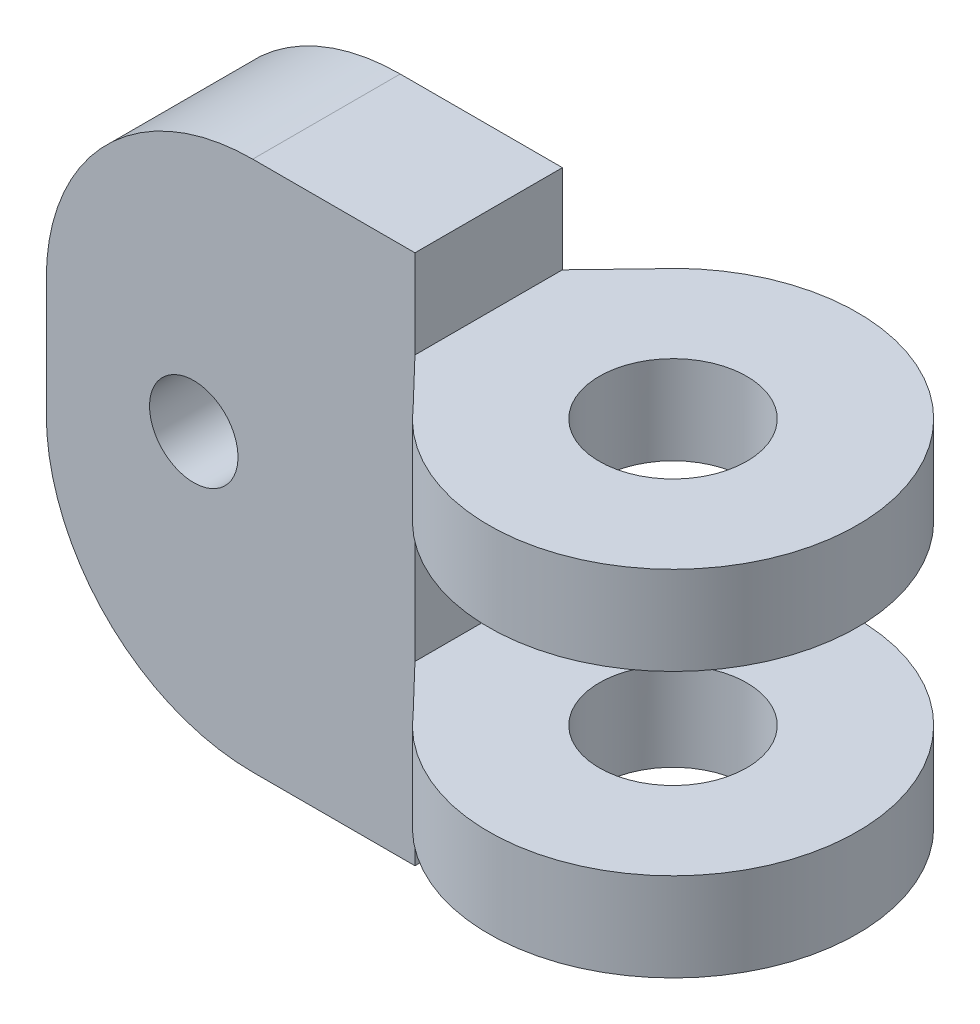
ISO-10303-21;
HEADER;
FILE_DESCRIPTION(('STEP AP214'),'2;1');
FILE_NAME('part.step','',(''),(''),'','','');
FILE_SCHEMA(('AUTOMOTIVE_DESIGN { 1 0 10303 214 1 1 1 1 }'));
ENDSEC;
DATA;
#1=APPLICATION_CONTEXT('core data for automotive mechanical design processes');
#2=APPLICATION_PROTOCOL_DEFINITION('international standard','automotive_design',2000,#1);
#3=PRODUCT_CONTEXT('',#1,'mechanical');
#4=PRODUCT('Part','Part','',(#3));
#5=PRODUCT_RELATED_PRODUCT_CATEGORY('part','',(#4));
#6=PRODUCT_DEFINITION_FORMATION('','',#4);
#7=PRODUCT_DEFINITION_CONTEXT('part definition',#1,'design');
#8=PRODUCT_DEFINITION('design','',#6,#7);
#9=PRODUCT_DEFINITION_SHAPE('','',#8);
#10=(LENGTH_UNIT() NAMED_UNIT(*) SI_UNIT(.MILLI.,.METRE.));
#11=(NAMED_UNIT(*) PLANE_ANGLE_UNIT() SI_UNIT($,.RADIAN.));
#12=(NAMED_UNIT(*) SI_UNIT($,.STERADIAN.) SOLID_ANGLE_UNIT());
#13=UNCERTAINTY_MEASURE_WITH_UNIT(LENGTH_MEASURE(1.E-05),#10,'distance_accuracy_value','');
#14=(GEOMETRIC_REPRESENTATION_CONTEXT(3) GLOBAL_UNCERTAINTY_ASSIGNED_CONTEXT((#13)) GLOBAL_UNIT_ASSIGNED_CONTEXT((#10,
#11,#12)) REPRESENTATION_CONTEXT('',''));
#15=CARTESIAN_POINT('',(0.,0.,0.));
#16=DIRECTION('',(0.,0.,1.));
#17=DIRECTION('',(1.,0.,0.));
#18=AXIS2_PLACEMENT_3D('',#15,#16,#17);
#19=CARTESIAN_POINT('',(23.75,2.1,15.));
#20=DIRECTION('',(0.,1.,0.));
#21=DIRECTION('',(-1.,0.,0.));
#22=AXIS2_PLACEMENT_3D('',#19,#20,#21);
#23=PLANE('',#22);
#24=CARTESIAN_POINT('',(17.5,2.1,7.5));
#25=DIRECTION('',(0.,1.,0.));
#26=DIRECTION('',(-1.,0.,0.));
#27=AXIS2_PLACEMENT_3D('',#24,#25,#26);
#28=CIRCLE('',#27,2.5);
#29=CARTESIAN_POINT('',(15.,2.1,7.5));
#30=VERTEX_POINT('',#29);
#31=EDGE_CURVE('E161',#30,#30,#28,.F.);
#32=ORIENTED_EDGE('',*,*,#31,.F.);
#33=EDGE_LOOP('',(#32));
#34=FACE_BOUND('',#33,.T.);
#35=DIRECTION('',(0.692941835068571,0.,0.720993490408756));
#36=VECTOR('',#35,1.);
#37=CARTESIAN_POINT('',(19.7501375964343,2.1,18.8442399700131));
#38=LINE('',#37,#36);
#39=CARTESIAN_POINT('',(11.25,2.1,9.99999999999995));
#40=VERTEX_POINT('',#39);
#41=CARTESIAN_POINT('',(12.7401622955997,2.1,11.5504870111839));
#42=VERTEX_POINT('',#41);
#43=EDGE_CURVE('E251',#40,#42,#38,.T.);
#44=ORIENTED_EDGE('',*,*,#43,.F.);
#45=DIRECTION('',(0.,0.,-1.));
#46=VECTOR('',#45,1.);
#47=CARTESIAN_POINT('',(11.25,2.1,15.));
#48=LINE('',#47,#46);
#49=CARTESIAN_POINT('',(11.25,2.1,4.99999999999995));
#50=VERTEX_POINT('',#49);
#51=EDGE_CURVE('E173',#40,#50,#48,.T.);
#52=ORIENTED_EDGE('',*,*,#51,.T.);
#53=DIRECTION('',(0.693247484581781,0.,-0.720699608103843));
#54=VECTOR('',#53,1.);
#55=CARTESIAN_POINT('',(12.2611690314164,2.1,3.94878937049695));
#56=LINE('',#55,#54);
#57=CARTESIAN_POINT('',(12.7306537946123,2.1,3.46071333362518));
#58=VERTEX_POINT('',#57);
#59=EDGE_CURVE('E222',#50,#58,#56,.T.);
#60=ORIENTED_EDGE('',*,*,#59,.T.);
#61=CARTESIAN_POINT('',(17.5,2.1,7.5));
#62=DIRECTION('',(0.,1.,0.));
#63=DIRECTION('',(-1.,0.,0.));
#64=AXIS2_PLACEMENT_3D('',#61,#62,#63);
#65=CIRCLE('',#64,6.25);
#66=EDGE_CURVE('E184',#42,#58,#65,.T.);
#67=ORIENTED_EDGE('',*,*,#66,.F.);
#68=EDGE_LOOP('',(#44,#52,#60,#67));
#69=FACE_BOUND('',#68,.T.);
#70=ADVANCED_FACE('F33',(#34,#69),#23,.F.);
#71=CARTESIAN_POINT('',(23.75,5.1,15.));
#72=DIRECTION('',(0.,-1.,0.));
#73=DIRECTION('',(1.,0.,0.));
#74=AXIS2_PLACEMENT_3D('',#71,#72,#73);
#75=PLANE('',#74);
#76=CARTESIAN_POINT('',(17.5,5.1,7.5));
#77=DIRECTION('',(0.,-1.,0.));
#78=DIRECTION('',(1.,0.,0.));
#79=AXIS2_PLACEMENT_3D('',#76,#77,#78);
#80=CIRCLE('',#79,2.5);
#81=CARTESIAN_POINT('',(20.,5.1,7.5));
#82=VERTEX_POINT('',#81);
#83=EDGE_CURVE('E166',#82,#82,#80,.F.);
#84=ORIENTED_EDGE('',*,*,#83,.F.);
#85=EDGE_LOOP('',(#84));
#86=FACE_BOUND('',#85,.T.);
#87=DIRECTION('',(-0.692941835068571,0.,-0.720993490408756));
#88=VECTOR('',#87,1.);
#89=CARTESIAN_POINT('',(19.7501375964343,5.1,18.8442399700131));
#90=LINE('',#89,#88);
#91=CARTESIAN_POINT('',(12.7401622955997,5.1,11.5504870111839));
#92=VERTEX_POINT('',#91);
#93=CARTESIAN_POINT('',(11.25,5.09999999999999,9.99999999999995));
#94=VERTEX_POINT('',#93);
#95=EDGE_CURVE('E246',#92,#94,#90,.T.);
#96=ORIENTED_EDGE('',*,*,#95,.F.);
#97=CARTESIAN_POINT('',(17.5,5.1,7.5));
#98=DIRECTION('',(0.,-1.,0.));
#99=DIRECTION('',(1.,0.,0.));
#100=AXIS2_PLACEMENT_3D('',#97,#98,#99);
#101=CIRCLE('',#100,6.25);
#102=CARTESIAN_POINT('',(12.7306537946123,5.09999999999999,3.46071333362518));
#103=VERTEX_POINT('',#102);
#104=EDGE_CURVE('E229',#103,#92,#101,.T.);
#105=ORIENTED_EDGE('',*,*,#104,.F.);
#106=DIRECTION('',(-0.693247484581781,0.,0.720699608103843));
#107=VECTOR('',#106,1.);
#108=CARTESIAN_POINT('',(12.2611690314164,5.1,3.94878937049695));
#109=LINE('',#108,#107);
#110=CARTESIAN_POINT('',(11.25,5.09999999999999,4.99999999999995));
#111=VERTEX_POINT('',#110);
#112=EDGE_CURVE('E219',#103,#111,#109,.T.);
#113=ORIENTED_EDGE('',*,*,#112,.T.);
#114=DIRECTION('',(0.,0.,-1.));
#115=VECTOR('',#114,1.);
#116=CARTESIAN_POINT('',(11.25,5.1,15.));
#117=LINE('',#116,#115);
#118=EDGE_CURVE('E171',#94,#111,#117,.T.);
#119=ORIENTED_EDGE('',*,*,#118,.F.);
#120=EDGE_LOOP('',(#96,#105,#113,#119));
#121=FACE_BOUND('',#120,.T.);
#122=ADVANCED_FACE('F239',(#86,#121),#75,.F.);
#123=CARTESIAN_POINT('',(11.25,11.1,15.));
#124=DIRECTION('',(0.,1.,0.));
#125=DIRECTION('',(0.,0.,1.));
#126=AXIS2_PLACEMENT_3D('',#123,#124,#125);
#127=PLANE('',#126);
#128=CARTESIAN_POINT('',(17.5,11.1,7.5));
#129=DIRECTION('',(0.,1.,0.));
#130=DIRECTION('',(0.,0.,1.));
#131=AXIS2_PLACEMENT_3D('',#128,#129,#130);
#132=CIRCLE('',#131,2.5);
#133=CARTESIAN_POINT('',(17.5,11.1,10.));
#134=VERTEX_POINT('',#133);
#135=EDGE_CURVE('E183',#134,#134,#132,.F.);
#136=ORIENTED_EDGE('',*,*,#135,.F.);
#137=EDGE_LOOP('',(#136));
#138=FACE_BOUND('',#137,.T.);
#139=DIRECTION('',(0.692941835068571,0.,0.720993490408756));
#140=VECTOR('',#139,1.);
#141=CARTESIAN_POINT('',(13.7480327615819,11.1,12.5991580660589));
#142=LINE('',#141,#140);
#143=CARTESIAN_POINT('',(11.25,11.1,9.99999999999995));
#144=VERTEX_POINT('',#143);
#145=CARTESIAN_POINT('',(12.7401622955997,11.1,11.5504870111839));
#146=VERTEX_POINT('',#145);
#147=EDGE_CURVE('E252',#144,#146,#142,.T.);
#148=ORIENTED_EDGE('',*,*,#147,.F.);
#149=DIRECTION('',(0.,0.,-1.));
#150=VECTOR('',#149,1.);
#151=CARTESIAN_POINT('',(11.25,11.1,15.));
#152=LINE('',#151,#150);
#153=CARTESIAN_POINT('',(11.25,11.1,4.99999999999995));
#154=VERTEX_POINT('',#153);
#155=EDGE_CURVE('E163',#144,#154,#152,.T.);
#156=ORIENTED_EDGE('',*,*,#155,.T.);
#157=DIRECTION('',(0.693247484581781,0.,-0.720699608103843));
#158=VECTOR('',#157,1.);
#159=CARTESIAN_POINT('',(6.25376809542928,11.1,10.1940792512103));
#160=LINE('',#159,#158);
#161=CARTESIAN_POINT('',(12.7306537946123,11.1,3.46071333362518));
#162=VERTEX_POINT('',#161);
#163=EDGE_CURVE('E216',#154,#162,#160,.T.);
#164=ORIENTED_EDGE('',*,*,#163,.T.);
#165=CARTESIAN_POINT('',(17.5,11.1,7.5));
#166=DIRECTION('',(0.,1.,0.));
#167=DIRECTION('',(0.,0.,1.));
#168=AXIS2_PLACEMENT_3D('',#165,#166,#167);
#169=CIRCLE('',#168,6.25);
#170=EDGE_CURVE('E227',#146,#162,#169,.T.);
#171=ORIENTED_EDGE('',*,*,#170,.F.);
#172=EDGE_LOOP('',(#148,#156,#164,#171));
#173=FACE_BOUND('',#172,.T.);
#174=ADVANCED_FACE('F242',(#138,#173),#127,.F.);
#175=CARTESIAN_POINT('',(23.75,14.1,15.));
#176=DIRECTION('',(0.,-1.,0.));
#177=DIRECTION('',(1.,0.,0.));
#178=AXIS2_PLACEMENT_3D('',#175,#176,#177);
#179=PLANE('',#178);
#180=CARTESIAN_POINT('',(17.5,14.1,7.5));
#181=DIRECTION('',(0.,-1.,0.));
#182=DIRECTION('',(1.,0.,0.));
#183=AXIS2_PLACEMENT_3D('',#180,#181,#182);
#184=CIRCLE('',#183,2.5);
#185=CARTESIAN_POINT('',(20.,14.1,7.5));
#186=VERTEX_POINT('',#185);
#187=EDGE_CURVE('E181',#186,#186,#184,.F.);
#188=ORIENTED_EDGE('',*,*,#187,.F.);
#189=EDGE_LOOP('',(#188));
#190=FACE_BOUND('',#189,.T.);
#191=DIRECTION('',(-0.692941835068571,0.,-0.720993490408756));
#192=VECTOR('',#191,1.);
#193=CARTESIAN_POINT('',(19.7501375964343,14.1,18.8442399700131));
#194=LINE('',#193,#192);
#195=CARTESIAN_POINT('',(12.7401622955997,14.1,11.5504870111839));
#196=VERTEX_POINT('',#195);
#197=CARTESIAN_POINT('',(11.25,14.1,9.99999999999995));
#198=VERTEX_POINT('',#197);
#199=EDGE_CURVE('E256',#196,#198,#194,.T.);
#200=ORIENTED_EDGE('',*,*,#199,.F.);
#201=CARTESIAN_POINT('',(17.5,14.1,7.5));
#202=DIRECTION('',(0.,-1.,0.));
#203=DIRECTION('',(1.,0.,0.));
#204=AXIS2_PLACEMENT_3D('',#201,#202,#203);
#205=CIRCLE('',#204,6.25);
#206=CARTESIAN_POINT('',(12.7306537946123,14.1,3.46071333362518));
#207=VERTEX_POINT('',#206);
#208=EDGE_CURVE('E225',#207,#196,#205,.T.);
#209=ORIENTED_EDGE('',*,*,#208,.F.);
#210=DIRECTION('',(-0.693247484581781,0.,0.720699608103843));
#211=VECTOR('',#210,1.);
#212=CARTESIAN_POINT('',(12.2611690314164,14.1,3.94878937049695));
#213=LINE('',#212,#211);
#214=CARTESIAN_POINT('',(11.25,14.1,4.99999999999995));
#215=VERTEX_POINT('',#214);
#216=EDGE_CURVE('E213',#207,#215,#213,.T.);
#217=ORIENTED_EDGE('',*,*,#216,.T.);
#218=DIRECTION('',(0.,0.,-1.));
#219=VECTOR('',#218,1.);
#220=CARTESIAN_POINT('',(11.25,14.1,15.));
#221=LINE('',#220,#219);
#222=EDGE_CURVE('E160',#198,#215,#221,.T.);
#223=ORIENTED_EDGE('',*,*,#222,.F.);
#224=EDGE_LOOP('',(#200,#209,#217,#223));
#225=FACE_BOUND('',#224,.T.);
#226=ADVANCED_FACE('F300',(#190,#225),#179,.F.);
#227=CARTESIAN_POINT('',(5.75000000000005,17.1,15.));
#228=DIRECTION('',(0.,-1.,0.));
#229=DIRECTION('',(0.,0.,-1.));
#230=AXIS2_PLACEMENT_3D('',#227,#228,#229);
#231=PLANE('',#230);
#232=DIRECTION('',(1.,0.,0.));
#233=VECTOR('',#232,1.);
#234=CARTESIAN_POINT('',(1.19791803681439E-13,17.1,9.99999999999999));
#235=LINE('',#234,#233);
#236=CARTESIAN_POINT('',(5.75,17.1,9.99999999999992));
#237=VERTEX_POINT('',#236);
#238=CARTESIAN_POINT('',(11.25,17.1,9.99999999999995));
#239=VERTEX_POINT('',#238);
#240=EDGE_CURVE('E141',#237,#239,#235,.T.);
#241=ORIENTED_EDGE('',*,*,#240,.T.);
#242=DIRECTION('',(0.,0.,-1.));
#243=VECTOR('',#242,1.);
#244=CARTESIAN_POINT('',(11.25,17.1,15.));
#245=LINE('',#244,#243);
#246=CARTESIAN_POINT('',(11.25,17.1,4.99999999999995));
#247=VERTEX_POINT('',#246);
#248=EDGE_CURVE('E153',#239,#247,#245,.T.);
#249=ORIENTED_EDGE('',*,*,#248,.T.);
#250=DIRECTION('',(1.,0.,0.));
#251=VECTOR('',#250,1.);
#252=CARTESIAN_POINT('',(0.,17.1,4.99999999999999));
#253=LINE('',#252,#251);
#254=CARTESIAN_POINT('',(5.75,17.1,4.99999999999992));
#255=VERTEX_POINT('',#254);
#256=EDGE_CURVE('E203',#255,#247,#253,.T.);
#257=ORIENTED_EDGE('',*,*,#256,.F.);
#258=DIRECTION('',(0.,0.,-1.));
#259=VECTOR('',#258,1.);
#260=CARTESIAN_POINT('',(5.75000000000005,17.1,15.));
#261=LINE('',#260,#259);
#262=EDGE_CURVE('E12',#237,#255,#261,.T.);
#263=ORIENTED_EDGE('',*,*,#262,.F.);
#264=EDGE_LOOP('',(#241,#249,#257,#263));
#265=FACE_BOUND('',#264,.T.);
#266=ADVANCED_FACE('F35',(#265),#231,.F.);
#267=CARTESIAN_POINT('',(5.75,10.1,15.));
#268=DIRECTION('',(0.,0.,-1.));
#269=DIRECTION('',(-1.,0.,0.));
#270=AXIS2_PLACEMENT_3D('',#267,#268,#269);
#271=CYLINDRICAL_SURFACE('',#270,7.);
#272=CARTESIAN_POINT('',(5.75,10.1,9.99999999999992));
#273=DIRECTION('',(0.,0.,1.));
#274=DIRECTION('',(1.,0.,0.));
#275=AXIS2_PLACEMENT_3D('',#272,#273,#274);
#276=CIRCLE('',#275,7.);
#277=CARTESIAN_POINT('',(-1.25,10.1,10.));
#278=VERTEX_POINT('',#277);
#279=EDGE_CURVE('E260',#237,#278,#276,.T.);
#280=ORIENTED_EDGE('',*,*,#279,.F.);
#281=ORIENTED_EDGE('',*,*,#262,.T.);
#282=CARTESIAN_POINT('',(5.75,10.1,4.99999999999992));
#283=DIRECTION('',(0.,0.,1.));
#284=DIRECTION('',(1.,0.,0.));
#285=AXIS2_PLACEMENT_3D('',#282,#283,#284);
#286=CIRCLE('',#285,7.);
#287=CARTESIAN_POINT('',(-1.25,10.1,5.00000000000001));
#288=VERTEX_POINT('',#287);
#289=EDGE_CURVE('E210',#255,#288,#286,.T.);
#290=ORIENTED_EDGE('',*,*,#289,.T.);
#291=DIRECTION('',(0.,0.,-1.));
#292=VECTOR('',#291,1.);
#293=CARTESIAN_POINT('',(-1.25,10.1,15.));
#294=LINE('',#293,#292);
#295=EDGE_CURVE('E42',#278,#288,#294,.T.);
#296=ORIENTED_EDGE('',*,*,#295,.F.);
#297=EDGE_LOOP('',(#280,#281,#290,#296));
#298=FACE_BOUND('',#297,.T.);
#299=ADVANCED_FACE('F338',(#298),#271,.T.);
#300=CARTESIAN_POINT('',(-1.25,6.10000000000005,15.));
#301=DIRECTION('',(1.,0.,0.));
#302=DIRECTION('',(0.,0.,-1.));
#303=AXIS2_PLACEMENT_3D('',#300,#301,#302);
#304=PLANE('',#303);
#305=DIRECTION('',(0.,-1.,0.));
#306=VECTOR('',#305,1.);
#307=CARTESIAN_POINT('',(-1.25,6.10000000000005,10.));
#308=LINE('',#307,#306);
#309=CARTESIAN_POINT('',(-1.25,6.10000000000005,10.));
#310=VERTEX_POINT('',#309);
#311=EDGE_CURVE('E262',#278,#310,#308,.T.);
#312=ORIENTED_EDGE('',*,*,#311,.F.);
#313=ORIENTED_EDGE('',*,*,#295,.T.);
#314=DIRECTION('',(0.,-1.,0.));
#315=VECTOR('',#314,1.);
#316=CARTESIAN_POINT('',(-1.25,6.10000000000005,5.00000000000001));
#317=LINE('',#316,#315);
#318=CARTESIAN_POINT('',(-1.25,6.10000000000005,5.00000000000001));
#319=VERTEX_POINT('',#318);
#320=EDGE_CURVE('E208',#288,#319,#317,.T.);
#321=ORIENTED_EDGE('',*,*,#320,.T.);
#322=DIRECTION('',(0.,0.,-1.));
#323=VECTOR('',#322,1.);
#324=CARTESIAN_POINT('',(-1.25,6.10000000000005,15.));
#325=LINE('',#324,#323);
#326=EDGE_CURVE('E57',#310,#319,#325,.T.);
#327=ORIENTED_EDGE('',*,*,#326,.F.);
#328=EDGE_LOOP('',(#312,#313,#321,#327));
#329=FACE_BOUND('',#328,.T.);
#330=ADVANCED_FACE('F336',(#329),#304,.F.);
#331=CARTESIAN_POINT('',(5.75,6.1,15.));
#332=DIRECTION('',(0.,0.,-1.));
#333=DIRECTION('',(-1.,0.,0.));
#334=AXIS2_PLACEMENT_3D('',#331,#332,#333);
#335=CYLINDRICAL_SURFACE('',#334,7.);
#336=CARTESIAN_POINT('',(5.75,6.1,9.99999999999992));
#337=DIRECTION('',(0.,0.,1.));
#338=DIRECTION('',(1.,0.,0.));
#339=AXIS2_PLACEMENT_3D('',#336,#337,#338);
#340=CIRCLE('',#339,7.);
#341=CARTESIAN_POINT('',(5.75000000000005,-0.9,9.99999999999992));
#342=VERTEX_POINT('',#341);
#343=EDGE_CURVE('E264',#310,#342,#340,.T.);
#344=ORIENTED_EDGE('',*,*,#343,.F.);
#345=ORIENTED_EDGE('',*,*,#326,.T.);
#346=CARTESIAN_POINT('',(5.75,6.1,4.99999999999992));
#347=DIRECTION('',(0.,0.,1.));
#348=DIRECTION('',(1.,0.,0.));
#349=AXIS2_PLACEMENT_3D('',#346,#347,#348);
#350=CIRCLE('',#349,7.);
#351=CARTESIAN_POINT('',(5.75000000000005,-0.9,4.99999999999992));
#352=VERTEX_POINT('',#351);
#353=EDGE_CURVE('E192',#319,#352,#350,.T.);
#354=ORIENTED_EDGE('',*,*,#353,.T.);
#355=DIRECTION('',(0.,0.,-1.));
#356=VECTOR('',#355,1.);
#357=CARTESIAN_POINT('',(5.75000000000005,-0.9,15.));
#358=LINE('',#357,#356);
#359=EDGE_CURVE('E177',#342,#352,#358,.T.);
#360=ORIENTED_EDGE('',*,*,#359,.F.);
#361=EDGE_LOOP('',(#344,#345,#354,#360));
#362=FACE_BOUND('',#361,.T.);
#363=ADVANCED_FACE('F332',(#362),#335,.T.);
#364=CARTESIAN_POINT('',(5.75000000000005,-0.9,15.));
#365=DIRECTION('',(0.,1.,0.));
#366=DIRECTION('',(0.,0.,1.));
#367=AXIS2_PLACEMENT_3D('',#364,#365,#366);
#368=PLANE('',#367);
#369=DIRECTION('',(1.,0.,0.));
#370=VECTOR('',#369,1.);
#371=CARTESIAN_POINT('',(5.74999999999999,-0.9,9.99999999999992));
#372=LINE('',#371,#370);
#373=CARTESIAN_POINT('',(11.25,-0.900000000000003,9.99999999999995));
#374=VERTEX_POINT('',#373);
#375=EDGE_CURVE('E266',#342,#374,#372,.T.);
#376=ORIENTED_EDGE('',*,*,#375,.F.);
#377=ORIENTED_EDGE('',*,*,#359,.T.);
#378=DIRECTION('',(1.,0.,0.));
#379=VECTOR('',#378,1.);
#380=CARTESIAN_POINT('',(5.74999999999993,-0.9,4.99999999999992));
#381=LINE('',#380,#379);
#382=CARTESIAN_POINT('',(11.25,-0.900000000000003,4.99999999999995));
#383=VERTEX_POINT('',#382);
#384=EDGE_CURVE('E187',#352,#383,#381,.T.);
#385=ORIENTED_EDGE('',*,*,#384,.T.);
#386=DIRECTION('',(0.,0.,-1.));
#387=VECTOR('',#386,1.);
#388=CARTESIAN_POINT('',(11.25,-0.9,15.));
#389=LINE('',#388,#387);
#390=EDGE_CURVE('E175',#374,#383,#389,.T.);
#391=ORIENTED_EDGE('',*,*,#390,.F.);
#392=EDGE_LOOP('',(#376,#377,#385,#391));
#393=FACE_BOUND('',#392,.T.);
#394=ADVANCED_FACE('F328',(#393),#368,.F.);
#395=CARTESIAN_POINT('',(11.25,2.1,15.));
#396=DIRECTION('',(-1.,0.,0.));
#397=DIRECTION('',(0.,-1.,0.));
#398=AXIS2_PLACEMENT_3D('',#395,#396,#397);
#399=PLANE('',#398);
#400=DIRECTION('',(0.,1.,0.));
#401=VECTOR('',#400,1.);
#402=CARTESIAN_POINT('',(11.25,-8.9,9.99999999999995));
#403=LINE('',#402,#401);
#404=EDGE_CURVE('E149',#374,#40,#403,.T.);
#405=ORIENTED_EDGE('',*,*,#404,.F.);
#406=ORIENTED_EDGE('',*,*,#390,.T.);
#407=DIRECTION('',(0.,1.,0.));
#408=VECTOR('',#407,1.);
#409=CARTESIAN_POINT('',(11.25,-8.9,4.99999999999995));
#410=LINE('',#409,#408);
#411=EDGE_CURVE('E200',#383,#50,#410,.T.);
#412=ORIENTED_EDGE('',*,*,#411,.T.);
#413=ORIENTED_EDGE('',*,*,#51,.F.);
#414=EDGE_LOOP('',(#405,#406,#412,#413));
#415=FACE_BOUND('',#414,.T.);
#416=ADVANCED_FACE('F325',(#415),#399,.F.);
#417=CARTESIAN_POINT('',(11.25,11.1,15.));
#418=DIRECTION('',(-1.,0.,0.));
#419=DIRECTION('',(0.,-1.,0.));
#420=AXIS2_PLACEMENT_3D('',#417,#418,#419);
#421=PLANE('',#420);
#422=EDGE_CURVE('E278',#94,#144,#403,.T.);
#423=ORIENTED_EDGE('',*,*,#422,.F.);
#424=ORIENTED_EDGE('',*,*,#118,.T.);
#425=EDGE_CURVE('E288',#111,#154,#410,.T.);
#426=ORIENTED_EDGE('',*,*,#425,.T.);
#427=ORIENTED_EDGE('',*,*,#155,.F.);
#428=EDGE_LOOP('',(#423,#424,#426,#427));
#429=FACE_BOUND('',#428,.T.);
#430=ADVANCED_FACE('F286',(#429),#421,.F.);
#431=CARTESIAN_POINT('',(11.25,17.1,15.));
#432=DIRECTION('',(-1.,0.,0.));
#433=DIRECTION('',(0.,-1.,0.));
#434=AXIS2_PLACEMENT_3D('',#431,#432,#433);
#435=PLANE('',#434);
#436=EDGE_CURVE('E138',#198,#239,#403,.T.);
#437=ORIENTED_EDGE('',*,*,#436,.F.);
#438=ORIENTED_EDGE('',*,*,#222,.T.);
#439=EDGE_CURVE('E159',#215,#247,#410,.T.);
#440=ORIENTED_EDGE('',*,*,#439,.T.);
#441=ORIENTED_EDGE('',*,*,#248,.F.);
#442=EDGE_LOOP('',(#437,#438,#440,#441));
#443=FACE_BOUND('',#442,.T.);
#444=ADVANCED_FACE('F157',(#443),#435,.F.);
#445=CARTESIAN_POINT('',(3.75,8.1,15.));
#446=DIRECTION('',(0.,0.,-1.));
#447=DIRECTION('',(-1.,0.,0.));
#448=AXIS2_PLACEMENT_3D('',#445,#446,#447);
#449=CYLINDRICAL_SURFACE('',#448,1.5);
#450=CARTESIAN_POINT('',(3.75,8.1,4.99999999999995));
#451=DIRECTION('',(0.,0.,1.));
#452=DIRECTION('',(1.,0.,0.));
#453=AXIS2_PLACEMENT_3D('',#450,#451,#452);
#454=CIRCLE('',#453,1.5);
#455=CARTESIAN_POINT('',(2.25,8.1,4.99999999999996));
#456=VERTEX_POINT('',#455);
#457=EDGE_CURVE('E185',#456,#456,#454,.T.);
#458=CARTESIAN_POINT('',(3.75,8.1,9.99999999999994));
#459=DIRECTION('',(0.,0.,1.));
#460=DIRECTION('',(1.,0.,0.));
#461=AXIS2_PLACEMENT_3D('',#458,#459,#460);
#462=CIRCLE('',#461,1.5);
#463=CARTESIAN_POINT('',(2.25,8.1,9.99999999999996));
#464=VERTEX_POINT('',#463);
#465=EDGE_CURVE('E37',#464,#464,#462,.T.);
#466=CARTESIAN_POINT('',(2.25,8.1,4.99999999999996));
#467=CARTESIAN_POINT('',(2.25,8.1,5.0520833333333));
#468=CARTESIAN_POINT('',(2.25,8.1,5.10416666666663));
#469=CARTESIAN_POINT('',(2.25,8.1,5.2083333333333));
#470=CARTESIAN_POINT('',(2.25,8.1,5.26041666666663));
#471=CARTESIAN_POINT('',(2.25,8.1,5.3645833333333));
#472=CARTESIAN_POINT('',(2.25,8.1,5.41666666666663));
#473=CARTESIAN_POINT('',(2.25,8.1,5.5208333333333));
#474=CARTESIAN_POINT('',(2.25,8.1,5.57291666666663));
#475=CARTESIAN_POINT('',(2.25,8.1,5.6770833333333));
#476=CARTESIAN_POINT('',(2.25,8.1,5.72916666666663));
#477=CARTESIAN_POINT('',(2.25,8.1,5.8333333333333));
#478=CARTESIAN_POINT('',(2.25,8.1,5.88541666666663));
#479=CARTESIAN_POINT('',(2.25,8.1,5.9895833333333));
#480=CARTESIAN_POINT('',(2.25,8.1,6.04166666666663));
#481=CARTESIAN_POINT('',(2.25,8.1,6.1458333333333));
#482=CARTESIAN_POINT('',(2.25,8.1,6.19791666666663));
#483=CARTESIAN_POINT('',(2.25,8.1,6.3020833333333));
#484=CARTESIAN_POINT('',(2.25,8.1,6.35416666666663));
#485=CARTESIAN_POINT('',(2.25,8.1,6.4583333333333));
#486=CARTESIAN_POINT('',(2.25,8.1,6.51041666666663));
#487=CARTESIAN_POINT('',(2.25,8.1,6.6145833333333));
#488=CARTESIAN_POINT('',(2.25,8.1,6.66666666666663));
#489=CARTESIAN_POINT('',(2.25,8.1,6.7708333333333));
#490=CARTESIAN_POINT('',(2.25,8.1,6.82291666666663));
#491=CARTESIAN_POINT('',(2.25,8.1,6.9270833333333));
#492=CARTESIAN_POINT('',(2.25,8.1,6.97916666666663));
#493=CARTESIAN_POINT('',(2.25,8.1,7.0833333333333));
#494=CARTESIAN_POINT('',(2.25,8.1,7.13541666666663));
#495=CARTESIAN_POINT('',(2.25,8.1,7.2395833333333));
#496=CARTESIAN_POINT('',(2.25,8.1,7.29166666666663));
#497=CARTESIAN_POINT('',(2.25,8.1,7.3958333333333));
#498=CARTESIAN_POINT('',(2.25,8.1,7.44791666666663));
#499=CARTESIAN_POINT('',(2.25,8.1,7.5520833333333));
#500=CARTESIAN_POINT('',(2.25,8.1,7.60416666666663));
#501=CARTESIAN_POINT('',(2.25,8.1,7.7083333333333));
#502=CARTESIAN_POINT('',(2.25,8.1,7.76041666666663));
#503=CARTESIAN_POINT('',(2.25,8.1,7.86458333333329));
#504=CARTESIAN_POINT('',(2.25,8.1,7.91666666666663));
#505=CARTESIAN_POINT('',(2.25,8.1,8.02083333333329));
#506=CARTESIAN_POINT('',(2.25,8.1,8.07291666666663));
#507=CARTESIAN_POINT('',(2.25,8.1,8.17708333333329));
#508=CARTESIAN_POINT('',(2.25,8.1,8.22916666666663));
#509=CARTESIAN_POINT('',(2.25,8.1,8.33333333333329));
#510=CARTESIAN_POINT('',(2.25,8.1,8.38541666666663));
#511=CARTESIAN_POINT('',(2.25,8.1,8.48958333333329));
#512=CARTESIAN_POINT('',(2.25,8.1,8.54166666666663));
#513=CARTESIAN_POINT('',(2.25,8.1,8.64583333333329));
#514=CARTESIAN_POINT('',(2.25,8.1,8.69791666666663));
#515=CARTESIAN_POINT('',(2.25,8.1,8.80208333333329));
#516=CARTESIAN_POINT('',(2.25,8.1,8.85416666666663));
#517=CARTESIAN_POINT('',(2.25,8.1,8.95833333333329));
#518=CARTESIAN_POINT('',(2.25,8.1,9.01041666666663));
#519=CARTESIAN_POINT('',(2.25,8.1,9.1145833333333));
#520=CARTESIAN_POINT('',(2.25,8.1,9.16666666666663));
#521=CARTESIAN_POINT('',(2.25,8.1,9.2708333333333));
#522=CARTESIAN_POINT('',(2.25,8.1,9.32291666666663));
#523=CARTESIAN_POINT('',(2.25,8.1,9.4270833333333));
#524=CARTESIAN_POINT('',(2.25,8.1,9.47916666666663));
#525=CARTESIAN_POINT('',(2.25,8.1,9.5833333333333));
#526=CARTESIAN_POINT('',(2.25,8.1,9.63541666666663));
#527=CARTESIAN_POINT('',(2.25,8.1,9.73958333333329));
#528=CARTESIAN_POINT('',(2.25,8.1,9.79166666666663));
#529=CARTESIAN_POINT('',(2.25,8.1,9.89583333333329));
#530=CARTESIAN_POINT('',(2.25,8.1,9.94791666666663));
#531=CARTESIAN_POINT('',(2.25,8.1,9.99999999999996));
#532=B_SPLINE_CURVE_WITH_KNOTS('',3,(#466,#467,#468,#469,#470,#471,#472,#473,#474,#475,#476,
#477,#478,#479,#480,#481,#482,#483,#484,#485,#486,#487,#488,#489,#490,#491,#492,#493,#494,#495,
#496,#497,#498,#499,#500,#501,#502,#503,#504,#505,#506,#507,#508,#509,#510,#511,#512,#513,#514,
#515,#516,#517,#518,#519,#520,#521,#522,#523,#524,#525,#526,#527,#528,#529,#530,#531),
.UNSPECIFIED.,.F.,.F.,(4,2,2,2,2,2,2,2,2,2,2,2,2,2,2,2,2,2,2,2,2,2,2,2,2,2,2,2,2,2,2,2,4),(0.,
0.15625,0.3125,0.46875,0.625000000000001,0.781250000000001,0.937499999999999,1.09375,1.25,
1.40625,1.5625,1.71875,1.875,2.03125,2.1875,2.34375,2.5,2.65625,2.8125,2.96875,3.125,3.28125,
3.4375,3.59375,3.75,3.90625,4.0625,4.21875,4.375,4.53125,4.6875,4.84375,5.),.UNSPECIFIED.);
#533=EDGE_CURVE('BSEAM371',#456,#464,#532,.T.);
#534=ORIENTED_EDGE('',*,*,#457,.F.);
#535=ORIENTED_EDGE('',*,*,#465,.T.);
#536=ORIENTED_EDGE('',*,*,#533,.T.);
#537=ORIENTED_EDGE('',*,*,#533,.F.);
#538=EDGE_LOOP('',(#534,#536,#535,#537));
#539=FACE_BOUND('',#538,.T.);
#540=ADVANCED_FACE('F371',(#539),#449,.F.);
#541=CARTESIAN_POINT('',(17.5,20.,7.5));
#542=DIRECTION('',(0.,-1.,0.));
#543=DIRECTION('',(0.,0.,-1.));
#544=AXIS2_PLACEMENT_3D('',#541,#542,#543);
#545=CYLINDRICAL_SURFACE('',#544,2.5);
#546=ORIENTED_EDGE('',*,*,#187,.T.);
#547=EDGE_LOOP('',(#546));
#548=FACE_BOUND('',#547,.T.);
#549=ORIENTED_EDGE('',*,*,#135,.T.);
#550=EDGE_LOOP('',(#549));
#551=FACE_BOUND('',#550,.T.);
#552=ADVANCED_FACE('F373',(#548,#551),#545,.F.);
#553=ORIENTED_EDGE('',*,*,#83,.T.);
#554=EDGE_LOOP('',(#553));
#555=FACE_BOUND('',#554,.T.);
#556=ORIENTED_EDGE('',*,*,#31,.T.);
#557=EDGE_LOOP('',(#556));
#558=FACE_BOUND('',#557,.T.);
#559=ADVANCED_FACE('F236',(#555,#558),#545,.F.);
#560=CARTESIAN_POINT('',(17.5,20.,7.5));
#561=DIRECTION('',(0.,-1.,0.));
#562=DIRECTION('',(0.,0.,-1.));
#563=AXIS2_PLACEMENT_3D('',#560,#561,#562);
#564=CYLINDRICAL_SURFACE('',#563,6.25);
#565=ORIENTED_EDGE('',*,*,#66,.T.);
#566=DIRECTION('',(0.,1.,0.));
#567=VECTOR('',#566,1.);
#568=CARTESIAN_POINT('',(12.7306537946123,-8.9,3.46071333362518));
#569=LINE('',#568,#567);
#570=EDGE_CURVE('E188',#58,#103,#569,.T.);
#571=ORIENTED_EDGE('',*,*,#570,.T.);
#572=ORIENTED_EDGE('',*,*,#104,.T.);
#573=DIRECTION('',(0.,1.,0.));
#574=VECTOR('',#573,1.);
#575=CARTESIAN_POINT('',(12.7401622955997,-8.9,11.5504870111839));
#576=LINE('',#575,#574);
#577=EDGE_CURVE('E270',#42,#92,#576,.T.);
#578=ORIENTED_EDGE('',*,*,#577,.F.);
#579=EDGE_LOOP('',(#565,#571,#572,#578));
#580=FACE_BOUND('',#579,.T.);
#581=ADVANCED_FACE('F305',(#580),#564,.T.);
#582=ORIENTED_EDGE('',*,*,#170,.T.);
#583=EDGE_CURVE('E195',#162,#207,#569,.T.);
#584=ORIENTED_EDGE('',*,*,#583,.T.);
#585=ORIENTED_EDGE('',*,*,#208,.T.);
#586=EDGE_CURVE('E268',#146,#196,#576,.T.);
#587=ORIENTED_EDGE('',*,*,#586,.F.);
#588=EDGE_LOOP('',(#582,#584,#585,#587));
#589=FACE_BOUND('',#588,.T.);
#590=ADVANCED_FACE('F302',(#589),#564,.T.);
#591=CARTESIAN_POINT('',(8.34145510989687,-8.9,8.02372126703674));
#592=DIRECTION('',(0.720699608103843,0.,0.693247484581781));
#593=DIRECTION('',(0.693247484581781,0.,-0.720699608103843));
#594=AXIS2_PLACEMENT_3D('',#591,#592,#593);
#595=PLANE('',#594);
#596=EDGE_CURVE('E293',#50,#111,#410,.T.);
#597=ORIENTED_EDGE('',*,*,#596,.T.);
#598=ORIENTED_EDGE('',*,*,#112,.F.);
#599=ORIENTED_EDGE('',*,*,#570,.F.);
#600=ORIENTED_EDGE('',*,*,#59,.F.);
#601=EDGE_LOOP('',(#597,#598,#599,#600));
#602=FACE_BOUND('',#601,.T.);
#603=ADVANCED_FACE('F304',(#602),#595,.F.);
#604=EDGE_CURVE('E205',#154,#215,#410,.T.);
#605=ORIENTED_EDGE('',*,*,#604,.T.);
#606=ORIENTED_EDGE('',*,*,#216,.F.);
#607=ORIENTED_EDGE('',*,*,#583,.F.);
#608=ORIENTED_EDGE('',*,*,#163,.F.);
#609=EDGE_LOOP('',(#605,#606,#607,#608));
#610=FACE_BOUND('',#609,.T.);
#611=ADVANCED_FACE('F297',(#610),#595,.F.);
#612=CARTESIAN_POINT('',(0.,-8.9,4.99999999999999));
#613=DIRECTION('',(0.,0.,1.));
#614=DIRECTION('',(1.,0.,0.));
#615=AXIS2_PLACEMENT_3D('',#612,#613,#614);
#616=PLANE('',#615);
#617=ORIENTED_EDGE('',*,*,#457,.T.);
#618=EDGE_LOOP('',(#617));
#619=FACE_BOUND('',#618,.T.);
#620=ORIENTED_EDGE('',*,*,#256,.T.);
#621=ORIENTED_EDGE('',*,*,#439,.F.);
#622=ORIENTED_EDGE('',*,*,#604,.F.);
#623=ORIENTED_EDGE('',*,*,#425,.F.);
#624=ORIENTED_EDGE('',*,*,#596,.F.);
#625=ORIENTED_EDGE('',*,*,#411,.F.);
#626=ORIENTED_EDGE('',*,*,#384,.F.);
#627=ORIENTED_EDGE('',*,*,#353,.F.);
#628=ORIENTED_EDGE('',*,*,#320,.F.);
#629=ORIENTED_EDGE('',*,*,#289,.F.);
#630=EDGE_LOOP('',(#620,#621,#622,#623,#624,#625,#626,#627,#628,#629));
#631=FACE_BOUND('',#630,.T.);
#632=ADVANCED_FACE('F345',(#619,#631),#616,.F.);
#633=CARTESIAN_POINT('',(0.85204012546955,-8.9,-0.818889845676968));
#634=DIRECTION('',(-0.720993490408756,0.,0.692941835068571));
#635=DIRECTION('',(0.692941835068571,0.,0.720993490408756));
#636=AXIS2_PLACEMENT_3D('',#633,#634,#635);
#637=PLANE('',#636);
#638=ORIENTED_EDGE('',*,*,#43,.T.);
#639=ORIENTED_EDGE('',*,*,#577,.T.);
#640=ORIENTED_EDGE('',*,*,#95,.T.);
#641=EDGE_CURVE('E275',#40,#94,#403,.T.);
#642=ORIENTED_EDGE('',*,*,#641,.F.);
#643=EDGE_LOOP('',(#638,#639,#640,#642));
#644=FACE_BOUND('',#643,.T.);
#645=ADVANCED_FACE('F355',(#644),#637,.T.);
#646=ORIENTED_EDGE('',*,*,#147,.T.);
#647=ORIENTED_EDGE('',*,*,#586,.T.);
#648=ORIENTED_EDGE('',*,*,#199,.T.);
#649=EDGE_CURVE('E144',#144,#198,#403,.T.);
#650=ORIENTED_EDGE('',*,*,#649,.F.);
#651=EDGE_LOOP('',(#646,#647,#648,#650));
#652=FACE_BOUND('',#651,.T.);
#653=ADVANCED_FACE('F357',(#652),#637,.T.);
#654=CARTESIAN_POINT('',(1.19791803681439E-13,-8.9,9.99999999999999));
#655=DIRECTION('',(0.,0.,1.));
#656=DIRECTION('',(1.,0.,0.));
#657=AXIS2_PLACEMENT_3D('',#654,#655,#656);
#658=PLANE('',#657);
#659=ORIENTED_EDGE('',*,*,#465,.F.);
#660=EDGE_LOOP('',(#659));
#661=FACE_BOUND('',#660,.T.);
#662=ORIENTED_EDGE('',*,*,#279,.T.);
#663=ORIENTED_EDGE('',*,*,#311,.T.);
#664=ORIENTED_EDGE('',*,*,#343,.T.);
#665=ORIENTED_EDGE('',*,*,#375,.T.);
#666=ORIENTED_EDGE('',*,*,#404,.T.);
#667=ORIENTED_EDGE('',*,*,#641,.T.);
#668=ORIENTED_EDGE('',*,*,#422,.T.);
#669=ORIENTED_EDGE('',*,*,#649,.T.);
#670=ORIENTED_EDGE('',*,*,#436,.T.);
#671=ORIENTED_EDGE('',*,*,#240,.F.);
#672=EDGE_LOOP('',(#662,#663,#664,#665,#666,#667,#668,#669,#670,#671));
#673=FACE_BOUND('',#672,.T.);
#674=ADVANCED_FACE('F140',(#661,#673),#658,.T.);
#675=CLOSED_SHELL('',(#70,#122,#174,#226,#266,#299,#330,#363,#394,#416,#430,#444,#540,#552,#559,
#581,#590,#603,#611,#632,#645,#653,#674));
#676=MANIFOLD_SOLID_BREP('B2',#675);
#677=ADVANCED_BREP_SHAPE_REPRESENTATION('',(#18,#676),#14);
#678=SHAPE_DEFINITION_REPRESENTATION(#9,#677);
ENDSEC;
END-ISO-10303-21;
